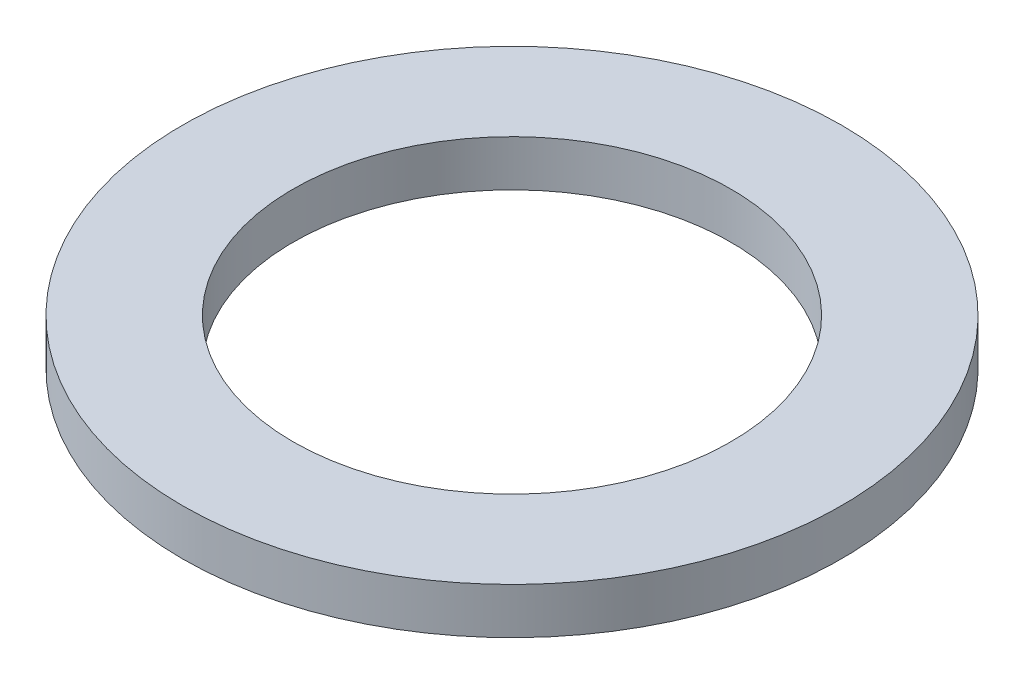
ISO-10303-21;
HEADER;
FILE_DESCRIPTION(('STEP AP214'),'2;1');
FILE_NAME('part.step','',(''),(''),'','','');
FILE_SCHEMA(('AUTOMOTIVE_DESIGN { 1 0 10303 214 1 1 1 1 }'));
ENDSEC;
DATA;
#1=APPLICATION_CONTEXT('core data for automotive mechanical design processes');
#2=APPLICATION_PROTOCOL_DEFINITION('international standard','automotive_design',2000,#1);
#3=PRODUCT_CONTEXT('',#1,'mechanical');
#4=PRODUCT('Part','Part','',(#3));
#5=PRODUCT_RELATED_PRODUCT_CATEGORY('part','',(#4));
#6=PRODUCT_DEFINITION_FORMATION('','',#4);
#7=PRODUCT_DEFINITION_CONTEXT('part definition',#1,'design');
#8=PRODUCT_DEFINITION('design','',#6,#7);
#9=PRODUCT_DEFINITION_SHAPE('','',#8);
#10=(LENGTH_UNIT() NAMED_UNIT(*) SI_UNIT(.MILLI.,.METRE.));
#11=(NAMED_UNIT(*) PLANE_ANGLE_UNIT() SI_UNIT($,.RADIAN.));
#12=(NAMED_UNIT(*) SI_UNIT($,.STERADIAN.) SOLID_ANGLE_UNIT());
#13=UNCERTAINTY_MEASURE_WITH_UNIT(LENGTH_MEASURE(1.E-05),#10,'distance_accuracy_value','');
#14=(GEOMETRIC_REPRESENTATION_CONTEXT(3) GLOBAL_UNCERTAINTY_ASSIGNED_CONTEXT((#13)) GLOBAL_UNIT_ASSIGNED_CONTEXT((#10,
#11,#12)) REPRESENTATION_CONTEXT('',''));
#15=CARTESIAN_POINT('',(0.,0.,0.));
#16=DIRECTION('',(0.,0.,1.));
#17=DIRECTION('',(1.,0.,0.));
#18=AXIS2_PLACEMENT_3D('',#15,#16,#17);
#19=CARTESIAN_POINT('',(0.,1.,0.));
#20=DIRECTION('',(0.,1.,0.));
#21=DIRECTION('',(0.,0.,1.));
#22=AXIS2_PLACEMENT_3D('',#19,#20,#21);
#23=PLANE('',#22);
#24=CARTESIAN_POINT('',(0.,1.,0.));
#25=DIRECTION('',(0.,1.,0.));
#26=DIRECTION('',(0.,0.,1.));
#27=AXIS2_PLACEMENT_3D('',#24,#25,#26);
#28=CIRCLE('',#27,7.15);
#29=CARTESIAN_POINT('',(0.,1.,7.15));
#30=VERTEX_POINT('',#29);
#31=EDGE_CURVE('E10',#30,#30,#28,.T.);
#32=ORIENTED_EDGE('',*,*,#31,.T.);
#33=EDGE_LOOP('',(#32));
#34=FACE_BOUND('',#33,.T.);
#35=CARTESIAN_POINT('',(0.,1.,0.));
#36=DIRECTION('',(0.,1.,0.));
#37=DIRECTION('',(0.,0.,1.));
#38=AXIS2_PLACEMENT_3D('',#35,#36,#37);
#39=CIRCLE('',#38,4.75);
#40=CARTESIAN_POINT('',(0.,1.,4.75));
#41=VERTEX_POINT('',#40);
#42=EDGE_CURVE('E44',#41,#41,#39,.T.);
#43=ORIENTED_EDGE('',*,*,#42,.F.);
#44=EDGE_LOOP('',(#43));
#45=FACE_BOUND('',#44,.T.);
#46=ADVANCED_FACE('F33',(#34,#45),#23,.T.);
#47=CARTESIAN_POINT('',(0.,0.,0.));
#48=DIRECTION('',(0.,1.,0.));
#49=DIRECTION('',(0.,0.,1.));
#50=AXIS2_PLACEMENT_3D('',#47,#48,#49);
#51=PLANE('',#50);
#52=CARTESIAN_POINT('',(0.,0.,0.));
#53=DIRECTION('',(0.,1.,0.));
#54=DIRECTION('',(0.,0.,1.));
#55=AXIS2_PLACEMENT_3D('',#52,#53,#54);
#56=CIRCLE('',#55,7.15);
#57=CARTESIAN_POINT('',(0.,0.,7.15));
#58=VERTEX_POINT('',#57);
#59=EDGE_CURVE('E37',#58,#58,#56,.T.);
#60=ORIENTED_EDGE('',*,*,#59,.F.);
#61=EDGE_LOOP('',(#60));
#62=FACE_BOUND('',#61,.T.);
#63=CARTESIAN_POINT('',(0.,0.,0.));
#64=DIRECTION('',(0.,1.,0.));
#65=DIRECTION('',(0.,0.,1.));
#66=AXIS2_PLACEMENT_3D('',#63,#64,#65);
#67=CIRCLE('',#66,4.75);
#68=CARTESIAN_POINT('',(0.,0.,4.75));
#69=VERTEX_POINT('',#68);
#70=EDGE_CURVE('E46',#69,#69,#67,.T.);
#71=ORIENTED_EDGE('',*,*,#70,.T.);
#72=EDGE_LOOP('',(#71));
#73=FACE_BOUND('',#72,.T.);
#74=ADVANCED_FACE('F56',(#62,#73),#51,.F.);
#75=CARTESIAN_POINT('',(0.,1.,0.));
#76=DIRECTION('',(0.,-1.,0.));
#77=DIRECTION('',(0.,0.,-1.));
#78=AXIS2_PLACEMENT_3D('',#75,#76,#77);
#79=CYLINDRICAL_SURFACE('',#78,7.15);
#80=ORIENTED_EDGE('',*,*,#31,.F.);
#81=EDGE_LOOP('',(#80));
#82=FACE_BOUND('',#81,.T.);
#83=ORIENTED_EDGE('',*,*,#59,.T.);
#84=EDGE_LOOP('',(#83));
#85=FACE_BOUND('',#84,.T.);
#86=ADVANCED_FACE('F35',(#82,#85),#79,.T.);
#87=CARTESIAN_POINT('',(0.,1.,0.));
#88=DIRECTION('',(0.,-1.,0.));
#89=DIRECTION('',(0.,0.,-1.));
#90=AXIS2_PLACEMENT_3D('',#87,#88,#89);
#91=CYLINDRICAL_SURFACE('',#90,4.75);
#92=ORIENTED_EDGE('',*,*,#42,.T.);
#93=EDGE_LOOP('',(#92));
#94=FACE_BOUND('',#93,.T.);
#95=ORIENTED_EDGE('',*,*,#70,.F.);
#96=EDGE_LOOP('',(#95));
#97=FACE_BOUND('',#96,.T.);
#98=ADVANCED_FACE('F52',(#94,#97),#91,.F.);
#99=CLOSED_SHELL('',(#46,#74,#86,#98));
#100=MANIFOLD_SOLID_BREP('B2',#99);
#101=ADVANCED_BREP_SHAPE_REPRESENTATION('',(#18,#100),#14);
#102=SHAPE_DEFINITION_REPRESENTATION(#9,#101);
ENDSEC;
END-ISO-10303-21;
